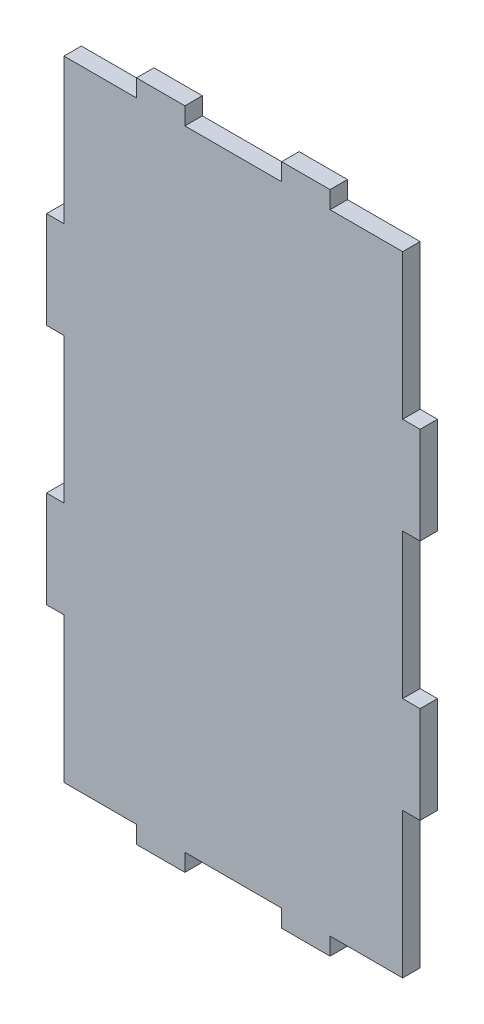
ISO-10303-21;
HEADER;
FILE_DESCRIPTION(('STEP AP214'),'2;1');
FILE_NAME('part.step','',(''),(''),'','','');
FILE_SCHEMA(('AUTOMOTIVE_DESIGN { 1 0 10303 214 1 1 1 1 }'));
ENDSEC;
DATA;
#1=APPLICATION_CONTEXT('core data for automotive mechanical design processes');
#2=APPLICATION_PROTOCOL_DEFINITION('international standard','automotive_design',2000,#1);
#3=PRODUCT_CONTEXT('',#1,'mechanical');
#4=PRODUCT('Part','Part','',(#3));
#5=PRODUCT_RELATED_PRODUCT_CATEGORY('part','',(#4));
#6=PRODUCT_DEFINITION_FORMATION('','',#4);
#7=PRODUCT_DEFINITION_CONTEXT('part definition',#1,'design');
#8=PRODUCT_DEFINITION('design','',#6,#7);
#9=PRODUCT_DEFINITION_SHAPE('','',#8);
#10=(LENGTH_UNIT() NAMED_UNIT(*) SI_UNIT(.MILLI.,.METRE.));
#11=(NAMED_UNIT(*) PLANE_ANGLE_UNIT() SI_UNIT($,.RADIAN.));
#12=(NAMED_UNIT(*) SI_UNIT($,.STERADIAN.) SOLID_ANGLE_UNIT());
#13=UNCERTAINTY_MEASURE_WITH_UNIT(LENGTH_MEASURE(1.E-05),#10,'distance_accuracy_value','');
#14=(GEOMETRIC_REPRESENTATION_CONTEXT(3) GLOBAL_UNCERTAINTY_ASSIGNED_CONTEXT((#13)) GLOBAL_UNIT_ASSIGNED_CONTEXT((#10,
#11,#12)) REPRESENTATION_CONTEXT('',''));
#15=CARTESIAN_POINT('',(0.,0.,0.));
#16=DIRECTION('',(0.,0.,1.));
#17=DIRECTION('',(1.,0.,0.));
#18=AXIS2_PLACEMENT_3D('',#15,#16,#17);
#19=CARTESIAN_POINT('',(0.,0.,4.572));
#20=DIRECTION('',(1.,0.,0.));
#21=DIRECTION('',(0.,0.,-1.));
#22=AXIS2_PLACEMENT_3D('',#19,#20,#21);
#23=PLANE('',#22);
#24=DIRECTION('',(0.,-1.,0.));
#25=VECTOR('',#24,1.);
#26=CARTESIAN_POINT('',(0.,0.,0.));
#27=LINE('',#26,#25);
#28=CARTESIAN_POINT('',(0.,131.572,0.));
#29=VERTEX_POINT('',#28);
#30=CARTESIAN_POINT('',(0.,106.172,0.));
#31=VERTEX_POINT('',#30);
#32=EDGE_CURVE('E302',#29,#31,#27,.T.);
#33=ORIENTED_EDGE('',*,*,#32,.T.);
#34=DIRECTION('',(0.,0.,1.));
#35=VECTOR('',#34,1.);
#36=CARTESIAN_POINT('',(0.,106.172,0.));
#37=LINE('',#36,#35);
#38=CARTESIAN_POINT('',(0.,106.172,4.572));
#39=VERTEX_POINT('',#38);
#40=EDGE_CURVE('E492',#31,#39,#37,.T.);
#41=ORIENTED_EDGE('',*,*,#40,.T.);
#42=DIRECTION('',(0.,-1.,0.));
#43=VECTOR('',#42,1.);
#44=CARTESIAN_POINT('',(0.,0.,4.572));
#45=LINE('',#44,#43);
#46=CARTESIAN_POINT('',(0.,131.572,4.572));
#47=VERTEX_POINT('',#46);
#48=EDGE_CURVE('E314',#47,#39,#45,.T.);
#49=ORIENTED_EDGE('',*,*,#48,.F.);
#50=DIRECTION('',(0.,0.,1.));
#51=VECTOR('',#50,1.);
#52=CARTESIAN_POINT('',(0.,131.572,0.));
#53=LINE('',#52,#51);
#54=EDGE_CURVE('E467',#29,#47,#53,.T.);
#55=ORIENTED_EDGE('',*,*,#54,.F.);
#56=EDGE_LOOP('',(#33,#41,#49,#55));
#57=FACE_BOUND('',#56,.T.);
#58=ADVANCED_FACE('F33',(#57),#23,.F.);
#59=CARTESIAN_POINT('',(98.044,0.,4.572));
#60=DIRECTION('',(-1.,0.,0.));
#61=DIRECTION('',(0.,0.,1.));
#62=AXIS2_PLACEMENT_3D('',#59,#60,#61);
#63=PLANE('',#62);
#64=DIRECTION('',(0.,1.,0.));
#65=VECTOR('',#64,1.);
#66=CARTESIAN_POINT('',(98.044,0.,4.572));
#67=LINE('',#66,#65);
#68=CARTESIAN_POINT('',(98.044,42.672,4.572));
#69=VERTEX_POINT('',#68);
#70=CARTESIAN_POINT('',(98.044,68.072,4.572));
#71=VERTEX_POINT('',#70);
#72=EDGE_CURVE('E308',#69,#71,#67,.T.);
#73=ORIENTED_EDGE('',*,*,#72,.F.);
#74=DIRECTION('',(0.,0.,1.));
#75=VECTOR('',#74,1.);
#76=CARTESIAN_POINT('',(98.044,42.672,0.));
#77=LINE('',#76,#75);
#78=CARTESIAN_POINT('',(98.044,42.672,0.));
#79=VERTEX_POINT('',#78);
#80=EDGE_CURVE('E509',#79,#69,#77,.T.);
#81=ORIENTED_EDGE('',*,*,#80,.F.);
#82=DIRECTION('',(0.,1.,0.));
#83=VECTOR('',#82,1.);
#84=CARTESIAN_POINT('',(98.044,0.,0.));
#85=LINE('',#84,#83);
#86=CARTESIAN_POINT('',(98.044,68.072,0.));
#87=VERTEX_POINT('',#86);
#88=EDGE_CURVE('E294',#79,#87,#85,.T.);
#89=ORIENTED_EDGE('',*,*,#88,.T.);
#90=DIRECTION('',(0.,0.,1.));
#91=VECTOR('',#90,1.);
#92=CARTESIAN_POINT('',(98.044,68.072,0.));
#93=LINE('',#92,#91);
#94=EDGE_CURVE('E464',#87,#71,#93,.T.);
#95=ORIENTED_EDGE('',*,*,#94,.T.);
#96=EDGE_LOOP('',(#73,#81,#89,#95));
#97=FACE_BOUND('',#96,.T.);
#98=ADVANCED_FACE('F543',(#97),#63,.F.);
#99=CARTESIAN_POINT('',(0.,0.,4.572));
#100=DIRECTION('',(0.,1.,0.));
#101=DIRECTION('',(0.,0.,1.));
#102=AXIS2_PLACEMENT_3D('',#99,#100,#101);
#103=PLANE('',#102);
#104=DIRECTION('',(1.,0.,0.));
#105=VECTOR('',#104,1.);
#106=CARTESIAN_POINT('',(0.,0.,0.));
#107=LINE('',#106,#105);
#108=CARTESIAN_POINT('',(23.622,0.,0.));
#109=VERTEX_POINT('',#108);
#110=CARTESIAN_POINT('',(36.322,0.,0.));
#111=VERTEX_POINT('',#110);
#112=EDGE_CURVE('E295',#109,#111,#107,.T.);
#113=ORIENTED_EDGE('',*,*,#112,.T.);
#114=DIRECTION('',(0.,0.,1.));
#115=VECTOR('',#114,1.);
#116=CARTESIAN_POINT('',(36.322,0.,0.));
#117=LINE('',#116,#115);
#118=CARTESIAN_POINT('',(36.322,0.,4.572));
#119=VERTEX_POINT('',#118);
#120=EDGE_CURVE('E393',#111,#119,#117,.T.);
#121=ORIENTED_EDGE('',*,*,#120,.T.);
#122=DIRECTION('',(1.,0.,0.));
#123=VECTOR('',#122,1.);
#124=CARTESIAN_POINT('',(0.,0.,4.572));
#125=LINE('',#124,#123);
#126=CARTESIAN_POINT('',(23.622,0.,4.572));
#127=VERTEX_POINT('',#126);
#128=EDGE_CURVE('E310',#127,#119,#125,.T.);
#129=ORIENTED_EDGE('',*,*,#128,.F.);
#130=DIRECTION('',(0.,0.,1.));
#131=VECTOR('',#130,1.);
#132=CARTESIAN_POINT('',(23.622,0.,0.));
#133=LINE('',#132,#131);
#134=EDGE_CURVE('E319',#109,#127,#133,.T.);
#135=ORIENTED_EDGE('',*,*,#134,.F.);
#136=EDGE_LOOP('',(#113,#121,#129,#135));
#137=FACE_BOUND('',#136,.T.);
#138=ADVANCED_FACE('F584',(#137),#103,.F.);
#139=CARTESIAN_POINT('',(0.,174.244,4.572));
#140=DIRECTION('',(0.,-1.,0.));
#141=DIRECTION('',(0.,0.,-1.));
#142=AXIS2_PLACEMENT_3D('',#139,#140,#141);
#143=PLANE('',#142);
#144=DIRECTION('',(-1.,0.,0.));
#145=VECTOR('',#144,1.);
#146=CARTESIAN_POINT('',(0.,174.244,0.));
#147=LINE('',#146,#145);
#148=CARTESIAN_POINT('',(36.322,174.244,0.));
#149=VERTEX_POINT('',#148);
#150=CARTESIAN_POINT('',(23.622,174.244,0.));
#151=VERTEX_POINT('',#150);
#152=EDGE_CURVE('E37',#149,#151,#147,.T.);
#153=ORIENTED_EDGE('',*,*,#152,.T.);
#154=DIRECTION('',(0.,0.,1.));
#155=VECTOR('',#154,1.);
#156=CARTESIAN_POINT('',(23.622,174.244,0.));
#157=LINE('',#156,#155);
#158=CARTESIAN_POINT('',(23.622,174.244,4.572));
#159=VERTEX_POINT('',#158);
#160=EDGE_CURVE('E366',#151,#159,#157,.T.);
#161=ORIENTED_EDGE('',*,*,#160,.T.);
#162=DIRECTION('',(-1.,0.,0.));
#163=VECTOR('',#162,1.);
#164=CARTESIAN_POINT('',(0.,174.244,4.572));
#165=LINE('',#164,#163);
#166=CARTESIAN_POINT('',(36.322,174.244,4.572));
#167=VERTEX_POINT('',#166);
#168=EDGE_CURVE('E42',#167,#159,#165,.T.);
#169=ORIENTED_EDGE('',*,*,#168,.F.);
#170=DIRECTION('',(0.,0.,1.));
#171=VECTOR('',#170,1.);
#172=CARTESIAN_POINT('',(36.322,174.244,0.));
#173=LINE('',#172,#171);
#174=EDGE_CURVE('E343',#149,#167,#173,.T.);
#175=ORIENTED_EDGE('',*,*,#174,.F.);
#176=EDGE_LOOP('',(#153,#161,#169,#175));
#177=FACE_BOUND('',#176,.T.);
#178=ADVANCED_FACE('F640',(#177),#143,.F.);
#179=CARTESIAN_POINT('',(0.,68.072,4.572));
#180=VERTEX_POINT('',#179);
#181=CARTESIAN_POINT('',(0.,42.672,4.572));
#182=VERTEX_POINT('',#181);
#183=EDGE_CURVE('E315',#180,#182,#45,.T.);
#184=ORIENTED_EDGE('',*,*,#183,.F.);
#185=DIRECTION('',(0.,0.,1.));
#186=VECTOR('',#185,1.);
#187=CARTESIAN_POINT('',(0.,68.072,0.));
#188=LINE('',#187,#186);
#189=CARTESIAN_POINT('',(0.,68.072,0.));
#190=VERTEX_POINT('',#189);
#191=EDGE_CURVE('E485',#190,#180,#188,.T.);
#192=ORIENTED_EDGE('',*,*,#191,.F.);
#193=CARTESIAN_POINT('',(0.,42.672,0.));
#194=VERTEX_POINT('',#193);
#195=EDGE_CURVE('E303',#190,#194,#27,.T.);
#196=ORIENTED_EDGE('',*,*,#195,.T.);
#197=DIRECTION('',(0.,0.,1.));
#198=VECTOR('',#197,1.);
#199=CARTESIAN_POINT('',(0.,42.672,0.));
#200=LINE('',#199,#198);
#201=EDGE_CURVE('E428',#194,#182,#200,.T.);
#202=ORIENTED_EDGE('',*,*,#201,.T.);
#203=EDGE_LOOP('',(#184,#192,#196,#202));
#204=FACE_BOUND('',#203,.T.);
#205=ADVANCED_FACE('F35',(#204),#23,.F.);
#206=CARTESIAN_POINT('',(61.722,0.,4.572));
#207=VERTEX_POINT('',#206);
#208=CARTESIAN_POINT('',(74.422,0.,4.572));
#209=VERTEX_POINT('',#208);
#210=EDGE_CURVE('E311',#207,#209,#125,.T.);
#211=ORIENTED_EDGE('',*,*,#210,.F.);
#212=DIRECTION('',(0.,0.,1.));
#213=VECTOR('',#212,1.);
#214=CARTESIAN_POINT('',(61.722,0.,0.));
#215=LINE('',#214,#213);
#216=CARTESIAN_POINT('',(61.722,0.,0.));
#217=VERTEX_POINT('',#216);
#218=EDGE_CURVE('E396',#217,#207,#215,.T.);
#219=ORIENTED_EDGE('',*,*,#218,.F.);
#220=CARTESIAN_POINT('',(74.422,0.,0.));
#221=VERTEX_POINT('',#220);
#222=EDGE_CURVE('E298',#217,#221,#107,.T.);
#223=ORIENTED_EDGE('',*,*,#222,.T.);
#224=DIRECTION('',(0.,0.,1.));
#225=VECTOR('',#224,1.);
#226=CARTESIAN_POINT('',(74.422,0.,0.));
#227=LINE('',#226,#225);
#228=EDGE_CURVE('E381',#221,#209,#227,.T.);
#229=ORIENTED_EDGE('',*,*,#228,.T.);
#230=EDGE_LOOP('',(#211,#219,#223,#229));
#231=FACE_BOUND('',#230,.T.);
#232=ADVANCED_FACE('F567',(#231),#103,.F.);
#233=CARTESIAN_POINT('',(98.044,106.172,0.));
#234=VERTEX_POINT('',#233);
#235=CARTESIAN_POINT('',(98.044,131.572,0.));
#236=VERTEX_POINT('',#235);
#237=EDGE_CURVE('E283',#234,#236,#85,.T.);
#238=ORIENTED_EDGE('',*,*,#237,.T.);
#239=DIRECTION('',(0.,0.,1.));
#240=VECTOR('',#239,1.);
#241=CARTESIAN_POINT('',(98.044,131.572,0.));
#242=LINE('',#241,#240);
#243=CARTESIAN_POINT('',(98.044,131.572,4.572));
#244=VERTEX_POINT('',#243);
#245=EDGE_CURVE('E455',#236,#244,#242,.T.);
#246=ORIENTED_EDGE('',*,*,#245,.T.);
#247=CARTESIAN_POINT('',(98.044,106.172,4.572));
#248=VERTEX_POINT('',#247);
#249=EDGE_CURVE('E285',#248,#244,#67,.T.);
#250=ORIENTED_EDGE('',*,*,#249,.F.);
#251=DIRECTION('',(0.,0.,1.));
#252=VECTOR('',#251,1.);
#253=CARTESIAN_POINT('',(98.044,106.172,0.));
#254=LINE('',#253,#252);
#255=EDGE_CURVE('E271',#234,#248,#254,.T.);
#256=ORIENTED_EDGE('',*,*,#255,.F.);
#257=EDGE_LOOP('',(#238,#246,#250,#256));
#258=FACE_BOUND('',#257,.T.);
#259=ADVANCED_FACE('F281',(#258),#63,.F.);
#260=CARTESIAN_POINT('',(74.422,174.244,0.));
#261=VERTEX_POINT('',#260);
#262=CARTESIAN_POINT('',(61.722,174.244,0.));
#263=VERTEX_POINT('',#262);
#264=EDGE_CURVE('E318',#261,#263,#147,.T.);
#265=ORIENTED_EDGE('',*,*,#264,.T.);
#266=DIRECTION('',(0.,0.,1.));
#267=VECTOR('',#266,1.);
#268=CARTESIAN_POINT('',(61.722,174.244,0.));
#269=LINE('',#268,#267);
#270=CARTESIAN_POINT('',(61.722,174.244,4.572));
#271=VERTEX_POINT('',#270);
#272=EDGE_CURVE('E340',#263,#271,#269,.T.);
#273=ORIENTED_EDGE('',*,*,#272,.T.);
#274=CARTESIAN_POINT('',(74.422,174.244,4.572));
#275=VERTEX_POINT('',#274);
#276=EDGE_CURVE('E11',#275,#271,#165,.T.);
#277=ORIENTED_EDGE('',*,*,#276,.F.);
#278=DIRECTION('',(0.,0.,1.));
#279=VECTOR('',#278,1.);
#280=CARTESIAN_POINT('',(74.422,174.244,0.));
#281=LINE('',#280,#279);
#282=EDGE_CURVE('E417',#261,#275,#281,.T.);
#283=ORIENTED_EDGE('',*,*,#282,.F.);
#284=EDGE_LOOP('',(#265,#273,#277,#283));
#285=FACE_BOUND('',#284,.T.);
#286=ADVANCED_FACE('F647',(#285),#143,.F.);
#287=CARTESIAN_POINT('',(0.,0.,4.572));
#288=DIRECTION('',(0.,0.,-1.));
#289=DIRECTION('',(-1.,0.,0.));
#290=AXIS2_PLACEMENT_3D('',#287,#288,#289);
#291=PLANE('',#290);
#292=DIRECTION('',(-1.,0.,0.));
#293=VECTOR('',#292,1.);
#294=CARTESIAN_POINT('',(98.044,4.572,4.572));
#295=LINE('',#294,#293);
#296=CARTESIAN_POINT('',(93.472,4.572,4.572));
#297=VERTEX_POINT('',#296);
#298=CARTESIAN_POINT('',(74.422,4.572,4.572));
#299=VERTEX_POINT('',#298);
#300=EDGE_CURVE('E370',#297,#299,#295,.T.);
#301=ORIENTED_EDGE('',*,*,#300,.F.);
#302=DIRECTION('',(0.,-1.,0.));
#303=VECTOR('',#302,1.);
#304=CARTESIAN_POINT('',(93.472,4.572,4.572));
#305=LINE('',#304,#303);
#306=CARTESIAN_POINT('',(93.472,42.672,4.572));
#307=VERTEX_POINT('',#306);
#308=EDGE_CURVE('E516',#307,#297,#305,.T.);
#309=ORIENTED_EDGE('',*,*,#308,.F.);
#310=DIRECTION('',(-1.,0.,0.));
#311=VECTOR('',#310,1.);
#312=CARTESIAN_POINT('',(98.044,42.672,4.572));
#313=LINE('',#312,#311);
#314=EDGE_CURVE('E495',#69,#307,#313,.T.);
#315=ORIENTED_EDGE('',*,*,#314,.F.);
#316=ORIENTED_EDGE('',*,*,#72,.T.);
#317=DIRECTION('',(1.,0.,0.));
#318=VECTOR('',#317,1.);
#319=CARTESIAN_POINT('',(98.044,68.072,4.572));
#320=LINE('',#319,#318);
#321=CARTESIAN_POINT('',(93.472,68.072,4.572));
#322=VERTEX_POINT('',#321);
#323=EDGE_CURVE('E276',#322,#71,#320,.T.);
#324=ORIENTED_EDGE('',*,*,#323,.F.);
#325=DIRECTION('',(0.,-1.,0.));
#326=VECTOR('',#325,1.);
#327=CARTESIAN_POINT('',(93.472,106.172,4.572));
#328=LINE('',#327,#326);
#329=CARTESIAN_POINT('',(93.472,106.172,4.572));
#330=VERTEX_POINT('',#329);
#331=EDGE_CURVE('E530',#330,#322,#328,.T.);
#332=ORIENTED_EDGE('',*,*,#331,.F.);
#333=DIRECTION('',(-1.,0.,0.));
#334=VECTOR('',#333,1.);
#335=CARTESIAN_POINT('',(98.044,106.172,4.572));
#336=LINE('',#335,#334);
#337=EDGE_CURVE('E533',#248,#330,#336,.T.);
#338=ORIENTED_EDGE('',*,*,#337,.F.);
#339=ORIENTED_EDGE('',*,*,#249,.T.);
#340=DIRECTION('',(1.,0.,0.));
#341=VECTOR('',#340,1.);
#342=CARTESIAN_POINT('',(98.044,131.572,4.572));
#343=LINE('',#342,#341);
#344=CARTESIAN_POINT('',(93.472,131.572,4.572));
#345=VERTEX_POINT('',#344);
#346=EDGE_CURVE('E458',#345,#244,#343,.T.);
#347=ORIENTED_EDGE('',*,*,#346,.F.);
#348=DIRECTION('',(0.,-1.,0.));
#349=VECTOR('',#348,1.);
#350=CARTESIAN_POINT('',(93.472,169.672,4.572));
#351=LINE('',#350,#349);
#352=CARTESIAN_POINT('',(93.472,169.672,4.572));
#353=VERTEX_POINT('',#352);
#354=EDGE_CURVE('E461',#353,#345,#351,.T.);
#355=ORIENTED_EDGE('',*,*,#354,.F.);
#356=DIRECTION('',(1.,0.,0.));
#357=VECTOR('',#356,1.);
#358=CARTESIAN_POINT('',(98.044,169.672,4.572));
#359=LINE('',#358,#357);
#360=CARTESIAN_POINT('',(74.422,169.672,4.572));
#361=VERTEX_POINT('',#360);
#362=EDGE_CURVE('E421',#361,#353,#359,.T.);
#363=ORIENTED_EDGE('',*,*,#362,.F.);
#364=DIRECTION('',(0.,-1.,0.));
#365=VECTOR('',#364,1.);
#366=CARTESIAN_POINT('',(74.422,174.244,4.572));
#367=LINE('',#366,#365);
#368=EDGE_CURVE('E425',#275,#361,#367,.T.);
#369=ORIENTED_EDGE('',*,*,#368,.F.);
#370=ORIENTED_EDGE('',*,*,#276,.T.);
#371=DIRECTION('',(0.,1.,0.));
#372=VECTOR('',#371,1.);
#373=CARTESIAN_POINT('',(61.722,174.244,4.572));
#374=LINE('',#373,#372);
#375=CARTESIAN_POINT('',(61.722,169.672,4.572));
#376=VERTEX_POINT('',#375);
#377=EDGE_CURVE('E346',#376,#271,#374,.T.);
#378=ORIENTED_EDGE('',*,*,#377,.F.);
#379=DIRECTION('',(1.,0.,0.));
#380=VECTOR('',#379,1.);
#381=CARTESIAN_POINT('',(36.322,169.672,4.572));
#382=LINE('',#381,#380);
#383=CARTESIAN_POINT('',(36.322,169.672,4.572));
#384=VERTEX_POINT('',#383);
#385=EDGE_CURVE('E349',#384,#376,#382,.T.);
#386=ORIENTED_EDGE('',*,*,#385,.F.);
#387=DIRECTION('',(0.,-1.,0.));
#388=VECTOR('',#387,1.);
#389=CARTESIAN_POINT('',(36.322,174.244,4.572));
#390=LINE('',#389,#388);
#391=EDGE_CURVE('E352',#167,#384,#390,.T.);
#392=ORIENTED_EDGE('',*,*,#391,.F.);
#393=ORIENTED_EDGE('',*,*,#168,.T.);
#394=DIRECTION('',(0.,1.,0.));
#395=VECTOR('',#394,1.);
#396=CARTESIAN_POINT('',(23.622,174.244,4.572));
#397=LINE('',#396,#395);
#398=CARTESIAN_POINT('',(23.622,169.672,4.572));
#399=VERTEX_POINT('',#398);
#400=EDGE_CURVE('E371',#399,#159,#397,.T.);
#401=ORIENTED_EDGE('',*,*,#400,.F.);
#402=DIRECTION('',(1.,0.,0.));
#403=VECTOR('',#402,1.);
#404=CARTESIAN_POINT('',(0.,169.672,4.572));
#405=LINE('',#404,#403);
#406=CARTESIAN_POINT('',(4.572,169.672,4.572));
#407=VERTEX_POINT('',#406);
#408=EDGE_CURVE('E345',#407,#399,#405,.T.);
#409=ORIENTED_EDGE('',*,*,#408,.F.);
#410=DIRECTION('',(0.,1.,0.));
#411=VECTOR('',#410,1.);
#412=CARTESIAN_POINT('',(4.572,169.672,4.572));
#413=LINE('',#412,#411);
#414=CARTESIAN_POINT('',(4.572,131.572,4.572));
#415=VERTEX_POINT('',#414);
#416=EDGE_CURVE('E476',#415,#407,#413,.T.);
#417=ORIENTED_EDGE('',*,*,#416,.F.);
#418=DIRECTION('',(1.,0.,0.));
#419=VECTOR('',#418,1.);
#420=CARTESIAN_POINT('',(0.,131.572,4.572));
#421=LINE('',#420,#419);
#422=EDGE_CURVE('E457',#47,#415,#421,.T.);
#423=ORIENTED_EDGE('',*,*,#422,.F.);
#424=ORIENTED_EDGE('',*,*,#48,.T.);
#425=DIRECTION('',(-1.,0.,0.));
#426=VECTOR('',#425,1.);
#427=CARTESIAN_POINT('',(0.,106.172,4.572));
#428=LINE('',#427,#426);
#429=CARTESIAN_POINT('',(4.572,106.172,4.572));
#430=VERTEX_POINT('',#429);
#431=EDGE_CURVE('E496',#430,#39,#428,.T.);
#432=ORIENTED_EDGE('',*,*,#431,.F.);
#433=DIRECTION('',(0.,1.,0.));
#434=VECTOR('',#433,1.);
#435=CARTESIAN_POINT('',(4.572,106.172,4.572));
#436=LINE('',#435,#434);
#437=CARTESIAN_POINT('',(4.572,68.072,4.572));
#438=VERTEX_POINT('',#437);
#439=EDGE_CURVE('E499',#438,#430,#436,.T.);
#440=ORIENTED_EDGE('',*,*,#439,.F.);
#441=DIRECTION('',(1.,0.,0.));
#442=VECTOR('',#441,1.);
#443=CARTESIAN_POINT('',(0.,68.072,4.572));
#444=LINE('',#443,#442);
#445=EDGE_CURVE('E475',#180,#438,#444,.T.);
#446=ORIENTED_EDGE('',*,*,#445,.F.);
#447=ORIENTED_EDGE('',*,*,#183,.T.);
#448=DIRECTION('',(-1.,0.,0.));
#449=VECTOR('',#448,1.);
#450=CARTESIAN_POINT('',(0.,42.672,4.572));
#451=LINE('',#450,#449);
#452=CARTESIAN_POINT('',(4.572,42.672,4.572));
#453=VERTEX_POINT('',#452);
#454=EDGE_CURVE('E440',#453,#182,#451,.T.);
#455=ORIENTED_EDGE('',*,*,#454,.F.);
#456=DIRECTION('',(0.,1.,0.));
#457=VECTOR('',#456,1.);
#458=CARTESIAN_POINT('',(4.57200000000001,4.572,4.572));
#459=LINE('',#458,#457);
#460=CARTESIAN_POINT('',(4.57200000000001,4.572,4.572));
#461=VERTEX_POINT('',#460);
#462=EDGE_CURVE('E443',#461,#453,#459,.T.);
#463=ORIENTED_EDGE('',*,*,#462,.F.);
#464=DIRECTION('',(-1.,0.,0.));
#465=VECTOR('',#464,1.);
#466=CARTESIAN_POINT('',(0.,4.572,4.572));
#467=LINE('',#466,#465);
#468=CARTESIAN_POINT('',(23.622,4.572,4.572));
#469=VERTEX_POINT('',#468);
#470=EDGE_CURVE('E323',#469,#461,#467,.T.);
#471=ORIENTED_EDGE('',*,*,#470,.F.);
#472=DIRECTION('',(0.,1.,0.));
#473=VECTOR('',#472,1.);
#474=CARTESIAN_POINT('',(23.622,0.,4.572));
#475=LINE('',#474,#473);
#476=EDGE_CURVE('E327',#127,#469,#475,.T.);
#477=ORIENTED_EDGE('',*,*,#476,.F.);
#478=ORIENTED_EDGE('',*,*,#128,.T.);
#479=DIRECTION('',(0.,-1.,0.));
#480=VECTOR('',#479,1.);
#481=CARTESIAN_POINT('',(36.322,0.,4.572));
#482=LINE('',#481,#480);
#483=CARTESIAN_POINT('',(36.322,4.57200000000003,4.572));
#484=VERTEX_POINT('',#483);
#485=EDGE_CURVE('E385',#484,#119,#482,.T.);
#486=ORIENTED_EDGE('',*,*,#485,.F.);
#487=DIRECTION('',(-1.,0.,0.));
#488=VECTOR('',#487,1.);
#489=CARTESIAN_POINT('',(36.322,4.57200000000003,4.572));
#490=LINE('',#489,#488);
#491=CARTESIAN_POINT('',(61.722,4.57200000000003,4.572));
#492=VERTEX_POINT('',#491);
#493=EDGE_CURVE('E402',#492,#484,#490,.T.);
#494=ORIENTED_EDGE('',*,*,#493,.F.);
#495=DIRECTION('',(0.,1.,0.));
#496=VECTOR('',#495,1.);
#497=CARTESIAN_POINT('',(61.722,0.,4.572));
#498=LINE('',#497,#496);
#499=EDGE_CURVE('E406',#207,#492,#498,.T.);
#500=ORIENTED_EDGE('',*,*,#499,.F.);
#501=ORIENTED_EDGE('',*,*,#210,.T.);
#502=DIRECTION('',(0.,-1.,0.));
#503=VECTOR('',#502,1.);
#504=CARTESIAN_POINT('',(74.422,0.,4.572));
#505=LINE('',#504,#503);
#506=EDGE_CURVE('E386',#299,#209,#505,.T.);
#507=ORIENTED_EDGE('',*,*,#506,.F.);
#508=EDGE_LOOP('',(#301,#309,#315,#316,#324,#332,#338,#339,#347,#355,#363,#369,#370,#378,#386,
#392,#393,#401,#409,#417,#423,#424,#432,#440,#446,#447,#455,#463,#471,#477,#478,#486,#494,#500,
#501,#507));
#509=FACE_BOUND('',#508,.T.);
#510=ADVANCED_FACE('F551',(#509),#291,.F.);
#511=CARTESIAN_POINT('',(0.,0.,0.));
#512=DIRECTION('',(0.,0.,-1.));
#513=DIRECTION('',(-1.,0.,0.));
#514=AXIS2_PLACEMENT_3D('',#511,#512,#513);
#515=PLANE('',#514);
#516=DIRECTION('',(0.,-1.,0.));
#517=VECTOR('',#516,1.);
#518=CARTESIAN_POINT('',(93.472,4.572,0.));
#519=LINE('',#518,#517);
#520=CARTESIAN_POINT('',(93.472,42.672,0.));
#521=VERTEX_POINT('',#520);
#522=CARTESIAN_POINT('',(93.472,4.572,0.));
#523=VERTEX_POINT('',#522);
#524=EDGE_CURVE('E512',#521,#523,#519,.T.);
#525=ORIENTED_EDGE('',*,*,#524,.T.);
#526=DIRECTION('',(-1.,0.,0.));
#527=VECTOR('',#526,1.);
#528=CARTESIAN_POINT('',(98.044,4.572,0.));
#529=LINE('',#528,#527);
#530=CARTESIAN_POINT('',(74.422,4.572,0.));
#531=VERTEX_POINT('',#530);
#532=EDGE_CURVE('E388',#523,#531,#529,.T.);
#533=ORIENTED_EDGE('',*,*,#532,.T.);
#534=DIRECTION('',(0.,-1.,0.));
#535=VECTOR('',#534,1.);
#536=CARTESIAN_POINT('',(74.422,0.,0.));
#537=LINE('',#536,#535);
#538=EDGE_CURVE('E382',#531,#221,#537,.T.);
#539=ORIENTED_EDGE('',*,*,#538,.T.);
#540=ORIENTED_EDGE('',*,*,#222,.F.);
#541=DIRECTION('',(0.,1.,0.));
#542=VECTOR('',#541,1.);
#543=CARTESIAN_POINT('',(61.722,0.,0.));
#544=LINE('',#543,#542);
#545=CARTESIAN_POINT('',(61.722,4.57200000000003,0.));
#546=VERTEX_POINT('',#545);
#547=EDGE_CURVE('E412',#217,#546,#544,.T.);
#548=ORIENTED_EDGE('',*,*,#547,.T.);
#549=DIRECTION('',(-1.,0.,0.));
#550=VECTOR('',#549,1.);
#551=CARTESIAN_POINT('',(36.322,4.57200000000003,0.));
#552=LINE('',#551,#550);
#553=CARTESIAN_POINT('',(36.322,4.57200000000003,0.));
#554=VERTEX_POINT('',#553);
#555=EDGE_CURVE('E397',#546,#554,#552,.T.);
#556=ORIENTED_EDGE('',*,*,#555,.T.);
#557=DIRECTION('',(0.,-1.,0.));
#558=VECTOR('',#557,1.);
#559=CARTESIAN_POINT('',(36.322,0.,0.));
#560=LINE('',#559,#558);
#561=EDGE_CURVE('E405',#554,#111,#560,.T.);
#562=ORIENTED_EDGE('',*,*,#561,.T.);
#563=ORIENTED_EDGE('',*,*,#112,.F.);
#564=DIRECTION('',(0.,1.,0.));
#565=VECTOR('',#564,1.);
#566=CARTESIAN_POINT('',(23.622,0.,0.));
#567=LINE('',#566,#565);
#568=CARTESIAN_POINT('',(23.622,4.572,0.));
#569=VERTEX_POINT('',#568);
#570=EDGE_CURVE('E326',#109,#569,#567,.T.);
#571=ORIENTED_EDGE('',*,*,#570,.T.);
#572=DIRECTION('',(-1.,0.,0.));
#573=VECTOR('',#572,1.);
#574=CARTESIAN_POINT('',(0.,4.572,0.));
#575=LINE('',#574,#573);
#576=CARTESIAN_POINT('',(4.57200000000001,4.572,0.));
#577=VERTEX_POINT('',#576);
#578=EDGE_CURVE('E321',#569,#577,#575,.T.);
#579=ORIENTED_EDGE('',*,*,#578,.T.);
#580=DIRECTION('',(0.,1.,0.));
#581=VECTOR('',#580,1.);
#582=CARTESIAN_POINT('',(4.57200000000001,4.572,0.));
#583=LINE('',#582,#581);
#584=CARTESIAN_POINT('',(4.572,42.672,0.));
#585=VERTEX_POINT('',#584);
#586=EDGE_CURVE('E442',#577,#585,#583,.T.);
#587=ORIENTED_EDGE('',*,*,#586,.T.);
#588=DIRECTION('',(-1.,0.,0.));
#589=VECTOR('',#588,1.);
#590=CARTESIAN_POINT('',(0.,42.672,0.));
#591=LINE('',#590,#589);
#592=EDGE_CURVE('E436',#585,#194,#591,.T.);
#593=ORIENTED_EDGE('',*,*,#592,.T.);
#594=ORIENTED_EDGE('',*,*,#195,.F.);
#595=DIRECTION('',(1.,0.,0.));
#596=VECTOR('',#595,1.);
#597=CARTESIAN_POINT('',(0.,68.072,0.));
#598=LINE('',#597,#596);
#599=CARTESIAN_POINT('',(4.572,68.072,0.));
#600=VERTEX_POINT('',#599);
#601=EDGE_CURVE('E498',#190,#600,#598,.T.);
#602=ORIENTED_EDGE('',*,*,#601,.T.);
#603=DIRECTION('',(0.,1.,0.));
#604=VECTOR('',#603,1.);
#605=CARTESIAN_POINT('',(4.572,106.172,0.));
#606=LINE('',#605,#604);
#607=CARTESIAN_POINT('',(4.572,106.172,0.));
#608=VERTEX_POINT('',#607);
#609=EDGE_CURVE('E50',#600,#608,#606,.T.);
#610=ORIENTED_EDGE('',*,*,#609,.T.);
#611=DIRECTION('',(-1.,0.,0.));
#612=VECTOR('',#611,1.);
#613=CARTESIAN_POINT('',(0.,106.172,0.));
#614=LINE('',#613,#612);
#615=EDGE_CURVE('E488',#608,#31,#614,.T.);
#616=ORIENTED_EDGE('',*,*,#615,.T.);
#617=ORIENTED_EDGE('',*,*,#32,.F.);
#618=DIRECTION('',(1.,0.,0.));
#619=VECTOR('',#618,1.);
#620=CARTESIAN_POINT('',(0.,131.572,0.));
#621=LINE('',#620,#619);
#622=CARTESIAN_POINT('',(4.572,131.572,0.));
#623=VERTEX_POINT('',#622);
#624=EDGE_CURVE('E478',#29,#623,#621,.T.);
#625=ORIENTED_EDGE('',*,*,#624,.T.);
#626=DIRECTION('',(0.,1.,0.));
#627=VECTOR('',#626,1.);
#628=CARTESIAN_POINT('',(4.572,169.672,0.));
#629=LINE('',#628,#627);
#630=CARTESIAN_POINT('',(4.572,169.672,0.));
#631=VERTEX_POINT('',#630);
#632=EDGE_CURVE('E470',#623,#631,#629,.T.);
#633=ORIENTED_EDGE('',*,*,#632,.T.);
#634=DIRECTION('',(1.,0.,0.));
#635=VECTOR('',#634,1.);
#636=CARTESIAN_POINT('',(0.,169.672,0.));
#637=LINE('',#636,#635);
#638=CARTESIAN_POINT('',(23.622,169.672,0.));
#639=VERTEX_POINT('',#638);
#640=EDGE_CURVE('E373',#631,#639,#637,.T.);
#641=ORIENTED_EDGE('',*,*,#640,.T.);
#642=DIRECTION('',(0.,1.,0.));
#643=VECTOR('',#642,1.);
#644=CARTESIAN_POINT('',(23.622,174.244,0.));
#645=LINE('',#644,#643);
#646=EDGE_CURVE('E367',#639,#151,#645,.T.);
#647=ORIENTED_EDGE('',*,*,#646,.T.);
#648=ORIENTED_EDGE('',*,*,#152,.F.);
#649=DIRECTION('',(0.,-1.,0.));
#650=VECTOR('',#649,1.);
#651=CARTESIAN_POINT('',(36.322,174.244,0.));
#652=LINE('',#651,#650);
#653=CARTESIAN_POINT('',(36.322,169.672,0.));
#654=VERTEX_POINT('',#653);
#655=EDGE_CURVE('E348',#149,#654,#652,.T.);
#656=ORIENTED_EDGE('',*,*,#655,.T.);
#657=DIRECTION('',(1.,0.,0.));
#658=VECTOR('',#657,1.);
#659=CARTESIAN_POINT('',(36.322,169.672,0.));
#660=LINE('',#659,#658);
#661=CARTESIAN_POINT('',(61.722,169.672,0.));
#662=VERTEX_POINT('',#661);
#663=EDGE_CURVE('E358',#654,#662,#660,.T.);
#664=ORIENTED_EDGE('',*,*,#663,.T.);
#665=DIRECTION('',(0.,1.,0.));
#666=VECTOR('',#665,1.);
#667=CARTESIAN_POINT('',(61.722,174.244,0.));
#668=LINE('',#667,#666);
#669=EDGE_CURVE('E338',#662,#263,#668,.T.);
#670=ORIENTED_EDGE('',*,*,#669,.T.);
#671=ORIENTED_EDGE('',*,*,#264,.F.);
#672=DIRECTION('',(0.,-1.,0.));
#673=VECTOR('',#672,1.);
#674=CARTESIAN_POINT('',(74.422,174.244,0.));
#675=LINE('',#674,#673);
#676=CARTESIAN_POINT('',(74.422,169.672,0.));
#677=VERTEX_POINT('',#676);
#678=EDGE_CURVE('E424',#261,#677,#675,.T.);
#679=ORIENTED_EDGE('',*,*,#678,.T.);
#680=DIRECTION('',(1.,0.,0.));
#681=VECTOR('',#680,1.);
#682=CARTESIAN_POINT('',(98.044,169.672,0.));
#683=LINE('',#682,#681);
#684=CARTESIAN_POINT('',(93.472,169.672,0.));
#685=VERTEX_POINT('',#684);
#686=EDGE_CURVE('E419',#677,#685,#683,.T.);
#687=ORIENTED_EDGE('',*,*,#686,.T.);
#688=DIRECTION('',(0.,-1.,0.));
#689=VECTOR('',#688,1.);
#690=CARTESIAN_POINT('',(93.472,169.672,0.));
#691=LINE('',#690,#689);
#692=CARTESIAN_POINT('',(93.472,131.572,0.));
#693=VERTEX_POINT('',#692);
#694=EDGE_CURVE('E460',#685,#693,#691,.T.);
#695=ORIENTED_EDGE('',*,*,#694,.T.);
#696=DIRECTION('',(1.,0.,0.));
#697=VECTOR('',#696,1.);
#698=CARTESIAN_POINT('',(98.044,131.572,0.));
#699=LINE('',#698,#697);
#700=EDGE_CURVE('E293',#693,#236,#699,.T.);
#701=ORIENTED_EDGE('',*,*,#700,.T.);
#702=ORIENTED_EDGE('',*,*,#237,.F.);
#703=DIRECTION('',(-1.,0.,0.));
#704=VECTOR('',#703,1.);
#705=CARTESIAN_POINT('',(98.044,106.172,0.));
#706=LINE('',#705,#704);
#707=CARTESIAN_POINT('',(93.472,106.172,0.));
#708=VERTEX_POINT('',#707);
#709=EDGE_CURVE('E267',#234,#708,#706,.T.);
#710=ORIENTED_EDGE('',*,*,#709,.T.);
#711=DIRECTION('',(0.,-1.,0.));
#712=VECTOR('',#711,1.);
#713=CARTESIAN_POINT('',(93.472,106.172,0.));
#714=LINE('',#713,#712);
#715=CARTESIAN_POINT('',(93.472,68.072,0.));
#716=VERTEX_POINT('',#715);
#717=EDGE_CURVE('E58',#708,#716,#714,.T.);
#718=ORIENTED_EDGE('',*,*,#717,.T.);
#719=DIRECTION('',(1.,0.,0.));
#720=VECTOR('',#719,1.);
#721=CARTESIAN_POINT('',(98.044,68.072,0.));
#722=LINE('',#721,#720);
#723=EDGE_CURVE('E286',#716,#87,#722,.T.);
#724=ORIENTED_EDGE('',*,*,#723,.T.);
#725=ORIENTED_EDGE('',*,*,#88,.F.);
#726=DIRECTION('',(-1.,0.,0.));
#727=VECTOR('',#726,1.);
#728=CARTESIAN_POINT('',(98.044,42.672,0.));
#729=LINE('',#728,#727);
#730=EDGE_CURVE('E518',#79,#521,#729,.T.);
#731=ORIENTED_EDGE('',*,*,#730,.T.);
#732=EDGE_LOOP('',(#525,#533,#539,#540,#548,#556,#562,#563,#571,#579,#587,#593,#594,#602,#610,
#616,#617,#625,#633,#641,#647,#648,#656,#664,#670,#671,#679,#687,#695,#701,#702,#710,#718,#724,
#725,#731));
#733=FACE_BOUND('',#732,.T.);
#734=ADVANCED_FACE('F290',(#733),#515,.T.);
#735=CARTESIAN_POINT('',(0.,4.572,0.));
#736=DIRECTION('',(0.,1.,0.));
#737=DIRECTION('',(0.,0.,1.));
#738=AXIS2_PLACEMENT_3D('',#735,#736,#737);
#739=PLANE('',#738);
#740=ORIENTED_EDGE('',*,*,#470,.T.);
#741=DIRECTION('',(0.,0.,1.));
#742=VECTOR('',#741,1.);
#743=CARTESIAN_POINT('',(4.57200000000001,4.572,0.));
#744=LINE('',#743,#742);
#745=EDGE_CURVE('E433',#577,#461,#744,.T.);
#746=ORIENTED_EDGE('',*,*,#745,.F.);
#747=ORIENTED_EDGE('',*,*,#578,.F.);
#748=DIRECTION('',(0.,0.,1.));
#749=VECTOR('',#748,1.);
#750=CARTESIAN_POINT('',(23.622,4.572,0.));
#751=LINE('',#750,#749);
#752=EDGE_CURVE('E305',#569,#469,#751,.T.);
#753=ORIENTED_EDGE('',*,*,#752,.T.);
#754=EDGE_LOOP('',(#740,#746,#747,#753));
#755=FACE_BOUND('',#754,.T.);
#756=ADVANCED_FACE('F594',(#755),#739,.F.);
#757=CARTESIAN_POINT('',(23.622,0.,0.));
#758=DIRECTION('',(1.,0.,0.));
#759=DIRECTION('',(0.,1.,0.));
#760=AXIS2_PLACEMENT_3D('',#757,#758,#759);
#761=PLANE('',#760);
#762=ORIENTED_EDGE('',*,*,#476,.T.);
#763=ORIENTED_EDGE('',*,*,#752,.F.);
#764=ORIENTED_EDGE('',*,*,#570,.F.);
#765=ORIENTED_EDGE('',*,*,#134,.T.);
#766=EDGE_LOOP('',(#762,#763,#764,#765));
#767=FACE_BOUND('',#766,.T.);
#768=ADVANCED_FACE('F591',(#767),#761,.F.);
#769=CARTESIAN_POINT('',(98.044,169.672,0.));
#770=DIRECTION('',(0.,-1.,0.));
#771=DIRECTION('',(0.,0.,-1.));
#772=AXIS2_PLACEMENT_3D('',#769,#770,#771);
#773=PLANE('',#772);
#774=ORIENTED_EDGE('',*,*,#362,.T.);
#775=DIRECTION('',(0.,0.,1.));
#776=VECTOR('',#775,1.);
#777=CARTESIAN_POINT('',(93.472,169.672,0.));
#778=LINE('',#777,#776);
#779=EDGE_CURVE('E451',#685,#353,#778,.T.);
#780=ORIENTED_EDGE('',*,*,#779,.F.);
#781=ORIENTED_EDGE('',*,*,#686,.F.);
#782=DIRECTION('',(0.,0.,1.));
#783=VECTOR('',#782,1.);
#784=CARTESIAN_POINT('',(74.422,169.672,0.));
#785=LINE('',#784,#783);
#786=EDGE_CURVE('E355',#677,#361,#785,.T.);
#787=ORIENTED_EDGE('',*,*,#786,.T.);
#788=EDGE_LOOP('',(#774,#780,#781,#787));
#789=FACE_BOUND('',#788,.T.);
#790=ADVANCED_FACE('F664',(#789),#773,.F.);
#791=CARTESIAN_POINT('',(74.422,174.244,0.));
#792=DIRECTION('',(-1.,0.,0.));
#793=DIRECTION('',(0.,0.,1.));
#794=AXIS2_PLACEMENT_3D('',#791,#792,#793);
#795=PLANE('',#794);
#796=ORIENTED_EDGE('',*,*,#368,.T.);
#797=ORIENTED_EDGE('',*,*,#786,.F.);
#798=ORIENTED_EDGE('',*,*,#678,.F.);
#799=ORIENTED_EDGE('',*,*,#282,.T.);
#800=EDGE_LOOP('',(#796,#797,#798,#799));
#801=FACE_BOUND('',#800,.T.);
#802=ADVANCED_FACE('F662',(#801),#795,.F.);
#803=CARTESIAN_POINT('',(36.322,174.244,0.));
#804=DIRECTION('',(-1.,0.,0.));
#805=DIRECTION('',(0.,-1.,0.));
#806=AXIS2_PLACEMENT_3D('',#803,#804,#805);
#807=PLANE('',#806);
#808=ORIENTED_EDGE('',*,*,#391,.T.);
#809=DIRECTION('',(0.,0.,1.));
#810=VECTOR('',#809,1.);
#811=CARTESIAN_POINT('',(36.322,169.672,0.));
#812=LINE('',#811,#810);
#813=EDGE_CURVE('E335',#654,#384,#812,.T.);
#814=ORIENTED_EDGE('',*,*,#813,.F.);
#815=ORIENTED_EDGE('',*,*,#655,.F.);
#816=ORIENTED_EDGE('',*,*,#174,.T.);
#817=EDGE_LOOP('',(#808,#814,#815,#816));
#818=FACE_BOUND('',#817,.T.);
#819=ADVANCED_FACE('F740',(#818),#807,.F.);
#820=CARTESIAN_POINT('',(61.722,174.244,0.));
#821=DIRECTION('',(1.,0.,0.));
#822=DIRECTION('',(0.,0.,-1.));
#823=AXIS2_PLACEMENT_3D('',#820,#821,#822);
#824=PLANE('',#823);
#825=ORIENTED_EDGE('',*,*,#377,.T.);
#826=ORIENTED_EDGE('',*,*,#272,.F.);
#827=ORIENTED_EDGE('',*,*,#669,.F.);
#828=DIRECTION('',(0.,0.,1.));
#829=VECTOR('',#828,1.);
#830=CARTESIAN_POINT('',(61.722,169.672,0.));
#831=LINE('',#830,#829);
#832=EDGE_CURVE('E337',#662,#376,#831,.T.);
#833=ORIENTED_EDGE('',*,*,#832,.T.);
#834=EDGE_LOOP('',(#825,#826,#827,#833));
#835=FACE_BOUND('',#834,.T.);
#836=ADVANCED_FACE('F652',(#835),#824,.F.);
#837=CARTESIAN_POINT('',(36.322,169.672,0.));
#838=DIRECTION('',(0.,-1.,0.));
#839=DIRECTION('',(0.,0.,-1.));
#840=AXIS2_PLACEMENT_3D('',#837,#838,#839);
#841=PLANE('',#840);
#842=ORIENTED_EDGE('',*,*,#385,.T.);
#843=ORIENTED_EDGE('',*,*,#832,.F.);
#844=ORIENTED_EDGE('',*,*,#663,.F.);
#845=ORIENTED_EDGE('',*,*,#813,.T.);
#846=EDGE_LOOP('',(#842,#843,#844,#845));
#847=FACE_BOUND('',#846,.T.);
#848=ADVANCED_FACE('F654',(#847),#841,.F.);
#849=CARTESIAN_POINT('',(23.622,174.244,0.));
#850=DIRECTION('',(1.,0.,0.));
#851=DIRECTION('',(0.,0.,-1.));
#852=AXIS2_PLACEMENT_3D('',#849,#850,#851);
#853=PLANE('',#852);
#854=ORIENTED_EDGE('',*,*,#400,.T.);
#855=ORIENTED_EDGE('',*,*,#160,.F.);
#856=ORIENTED_EDGE('',*,*,#646,.F.);
#857=DIRECTION('',(0.,0.,1.));
#858=VECTOR('',#857,1.);
#859=CARTESIAN_POINT('',(23.622,169.672,0.));
#860=LINE('',#859,#858);
#861=EDGE_CURVE('E363',#639,#399,#860,.T.);
#862=ORIENTED_EDGE('',*,*,#861,.T.);
#863=EDGE_LOOP('',(#854,#855,#856,#862));
#864=FACE_BOUND('',#863,.T.);
#865=ADVANCED_FACE('F636',(#864),#853,.F.);
#866=CARTESIAN_POINT('',(0.,169.672,0.));
#867=DIRECTION('',(0.,-1.,0.));
#868=DIRECTION('',(0.,0.,-1.));
#869=AXIS2_PLACEMENT_3D('',#866,#867,#868);
#870=PLANE('',#869);
#871=ORIENTED_EDGE('',*,*,#640,.F.);
#872=DIRECTION('',(0.,0.,1.));
#873=VECTOR('',#872,1.);
#874=CARTESIAN_POINT('',(4.572,169.672,0.));
#875=LINE('',#874,#873);
#876=EDGE_CURVE('E472',#631,#407,#875,.T.);
#877=ORIENTED_EDGE('',*,*,#876,.T.);
#878=ORIENTED_EDGE('',*,*,#408,.T.);
#879=ORIENTED_EDGE('',*,*,#861,.F.);
#880=EDGE_LOOP('',(#871,#877,#878,#879));
#881=FACE_BOUND('',#880,.T.);
#882=ADVANCED_FACE('F630',(#881),#870,.F.);
#883=CARTESIAN_POINT('',(74.422,0.,0.));
#884=DIRECTION('',(-1.,0.,0.));
#885=DIRECTION('',(0.,-1.,0.));
#886=AXIS2_PLACEMENT_3D('',#883,#884,#885);
#887=PLANE('',#886);
#888=ORIENTED_EDGE('',*,*,#506,.T.);
#889=ORIENTED_EDGE('',*,*,#228,.F.);
#890=ORIENTED_EDGE('',*,*,#538,.F.);
#891=DIRECTION('',(0.,0.,1.));
#892=VECTOR('',#891,1.);
#893=CARTESIAN_POINT('',(74.422,4.572,0.));
#894=LINE('',#893,#892);
#895=EDGE_CURVE('E378',#531,#299,#894,.T.);
#896=ORIENTED_EDGE('',*,*,#895,.T.);
#897=EDGE_LOOP('',(#888,#889,#890,#896));
#898=FACE_BOUND('',#897,.T.);
#899=ADVANCED_FACE('F564',(#898),#887,.F.);
#900=CARTESIAN_POINT('',(98.044,4.572,0.));
#901=DIRECTION('',(0.,1.,0.));
#902=DIRECTION('',(-1.,0.,0.));
#903=AXIS2_PLACEMENT_3D('',#900,#901,#902);
#904=PLANE('',#903);
#905=ORIENTED_EDGE('',*,*,#532,.F.);
#906=DIRECTION('',(0.,0.,1.));
#907=VECTOR('',#906,1.);
#908=CARTESIAN_POINT('',(93.472,4.572,0.));
#909=LINE('',#908,#907);
#910=EDGE_CURVE('E446',#523,#297,#909,.T.);
#911=ORIENTED_EDGE('',*,*,#910,.T.);
#912=ORIENTED_EDGE('',*,*,#300,.T.);
#913=ORIENTED_EDGE('',*,*,#895,.F.);
#914=EDGE_LOOP('',(#905,#911,#912,#913));
#915=FACE_BOUND('',#914,.T.);
#916=ADVANCED_FACE('F559',(#915),#904,.F.);
#917=CARTESIAN_POINT('',(36.322,0.,0.));
#918=DIRECTION('',(-1.,0.,0.));
#919=DIRECTION('',(0.,0.,1.));
#920=AXIS2_PLACEMENT_3D('',#917,#918,#919);
#921=PLANE('',#920);
#922=ORIENTED_EDGE('',*,*,#485,.T.);
#923=ORIENTED_EDGE('',*,*,#120,.F.);
#924=ORIENTED_EDGE('',*,*,#561,.F.);
#925=DIRECTION('',(0.,0.,1.));
#926=VECTOR('',#925,1.);
#927=CARTESIAN_POINT('',(36.322,4.57200000000003,0.));
#928=LINE('',#927,#926);
#929=EDGE_CURVE('E330',#554,#484,#928,.T.);
#930=ORIENTED_EDGE('',*,*,#929,.T.);
#931=EDGE_LOOP('',(#922,#923,#924,#930));
#932=FACE_BOUND('',#931,.T.);
#933=ADVANCED_FACE('F580',(#932),#921,.F.);
#934=CARTESIAN_POINT('',(36.322,4.57200000000003,0.));
#935=DIRECTION('',(0.,1.,0.));
#936=DIRECTION('',(0.,0.,1.));
#937=AXIS2_PLACEMENT_3D('',#934,#935,#936);
#938=PLANE('',#937);
#939=ORIENTED_EDGE('',*,*,#493,.T.);
#940=ORIENTED_EDGE('',*,*,#929,.F.);
#941=ORIENTED_EDGE('',*,*,#555,.F.);
#942=DIRECTION('',(0.,0.,1.));
#943=VECTOR('',#942,1.);
#944=CARTESIAN_POINT('',(61.722,4.57200000000003,0.));
#945=LINE('',#944,#943);
#946=EDGE_CURVE('E399',#546,#492,#945,.T.);
#947=ORIENTED_EDGE('',*,*,#946,.T.);
#948=EDGE_LOOP('',(#939,#940,#941,#947));
#949=FACE_BOUND('',#948,.T.);
#950=ADVANCED_FACE('F578',(#949),#938,.F.);
#951=CARTESIAN_POINT('',(61.722,0.,0.));
#952=DIRECTION('',(1.,0.,0.));
#953=DIRECTION('',(0.,0.,-1.));
#954=AXIS2_PLACEMENT_3D('',#951,#952,#953);
#955=PLANE('',#954);
#956=ORIENTED_EDGE('',*,*,#499,.T.);
#957=ORIENTED_EDGE('',*,*,#946,.F.);
#958=ORIENTED_EDGE('',*,*,#547,.F.);
#959=ORIENTED_EDGE('',*,*,#218,.T.);
#960=EDGE_LOOP('',(#956,#957,#958,#959));
#961=FACE_BOUND('',#960,.T.);
#962=ADVANCED_FACE('F574',(#961),#955,.F.);
#963=CARTESIAN_POINT('',(93.472,4.572,0.));
#964=DIRECTION('',(-1.,0.,0.));
#965=DIRECTION('',(0.,0.,1.));
#966=AXIS2_PLACEMENT_3D('',#963,#964,#965);
#967=PLANE('',#966);
#968=ORIENTED_EDGE('',*,*,#308,.T.);
#969=ORIENTED_EDGE('',*,*,#910,.F.);
#970=ORIENTED_EDGE('',*,*,#524,.F.);
#971=DIRECTION('',(0.,0.,1.));
#972=VECTOR('',#971,1.);
#973=CARTESIAN_POINT('',(93.472,42.672,0.));
#974=LINE('',#973,#972);
#975=EDGE_CURVE('E511',#521,#307,#974,.T.);
#976=ORIENTED_EDGE('',*,*,#975,.T.);
#977=EDGE_LOOP('',(#968,#969,#970,#976));
#978=FACE_BOUND('',#977,.T.);
#979=ADVANCED_FACE('F555',(#978),#967,.F.);
#980=CARTESIAN_POINT('',(98.044,42.672,0.));
#981=DIRECTION('',(0.,1.,0.));
#982=DIRECTION('',(0.,0.,1.));
#983=AXIS2_PLACEMENT_3D('',#980,#981,#982);
#984=PLANE('',#983);
#985=ORIENTED_EDGE('',*,*,#314,.T.);
#986=ORIENTED_EDGE('',*,*,#975,.F.);
#987=ORIENTED_EDGE('',*,*,#730,.F.);
#988=ORIENTED_EDGE('',*,*,#80,.T.);
#989=EDGE_LOOP('',(#985,#986,#987,#988));
#990=FACE_BOUND('',#989,.T.);
#991=ADVANCED_FACE('F547',(#990),#984,.F.);
#992=CARTESIAN_POINT('',(4.572,169.672,0.));
#993=DIRECTION('',(1.,0.,0.));
#994=DIRECTION('',(0.,1.,0.));
#995=AXIS2_PLACEMENT_3D('',#992,#993,#994);
#996=PLANE('',#995);
#997=ORIENTED_EDGE('',*,*,#416,.T.);
#998=ORIENTED_EDGE('',*,*,#876,.F.);
#999=ORIENTED_EDGE('',*,*,#632,.F.);
#1000=DIRECTION('',(0.,0.,1.));
#1001=VECTOR('',#1000,1.);
#1002=CARTESIAN_POINT('',(4.572,131.572,0.));
#1003=LINE('',#1002,#1001);
#1004=EDGE_CURVE('E469',#623,#415,#1003,.T.);
#1005=ORIENTED_EDGE('',*,*,#1004,.T.);
#1006=EDGE_LOOP('',(#997,#998,#999,#1005));
#1007=FACE_BOUND('',#1006,.T.);
#1008=ADVANCED_FACE('F627',(#1007),#996,.F.);
#1009=CARTESIAN_POINT('',(0.,131.572,0.));
#1010=DIRECTION('',(0.,-1.,0.));
#1011=DIRECTION('',(0.,0.,-1.));
#1012=AXIS2_PLACEMENT_3D('',#1009,#1010,#1011);
#1013=PLANE('',#1012);
#1014=ORIENTED_EDGE('',*,*,#422,.T.);
#1015=ORIENTED_EDGE('',*,*,#1004,.F.);
#1016=ORIENTED_EDGE('',*,*,#624,.F.);
#1017=ORIENTED_EDGE('',*,*,#54,.T.);
#1018=EDGE_LOOP('',(#1014,#1015,#1016,#1017));
#1019=FACE_BOUND('',#1018,.T.);
#1020=ADVANCED_FACE('F624',(#1019),#1013,.F.);
#1021=CARTESIAN_POINT('',(98.044,131.572,0.));
#1022=DIRECTION('',(0.,-1.,0.));
#1023=DIRECTION('',(0.,0.,-1.));
#1024=AXIS2_PLACEMENT_3D('',#1021,#1022,#1023);
#1025=PLANE('',#1024);
#1026=ORIENTED_EDGE('',*,*,#346,.T.);
#1027=ORIENTED_EDGE('',*,*,#245,.F.);
#1028=ORIENTED_EDGE('',*,*,#700,.F.);
#1029=DIRECTION('',(0.,0.,1.));
#1030=VECTOR('',#1029,1.);
#1031=CARTESIAN_POINT('',(93.472,131.572,0.));
#1032=LINE('',#1031,#1030);
#1033=EDGE_CURVE('E453',#693,#345,#1032,.T.);
#1034=ORIENTED_EDGE('',*,*,#1033,.T.);
#1035=EDGE_LOOP('',(#1026,#1027,#1028,#1034));
#1036=FACE_BOUND('',#1035,.T.);
#1037=ADVANCED_FACE('F670',(#1036),#1025,.F.);
#1038=CARTESIAN_POINT('',(93.472,169.672,0.));
#1039=DIRECTION('',(-1.,0.,0.));
#1040=DIRECTION('',(0.,-1.,0.));
#1041=AXIS2_PLACEMENT_3D('',#1038,#1039,#1040);
#1042=PLANE('',#1041);
#1043=ORIENTED_EDGE('',*,*,#354,.T.);
#1044=ORIENTED_EDGE('',*,*,#1033,.F.);
#1045=ORIENTED_EDGE('',*,*,#694,.F.);
#1046=ORIENTED_EDGE('',*,*,#779,.T.);
#1047=EDGE_LOOP('',(#1043,#1044,#1045,#1046));
#1048=FACE_BOUND('',#1047,.T.);
#1049=ADVANCED_FACE('F667',(#1048),#1042,.F.);
#1050=CARTESIAN_POINT('',(0.,42.672,0.));
#1051=DIRECTION('',(0.,1.,0.));
#1052=DIRECTION('',(0.,0.,1.));
#1053=AXIS2_PLACEMENT_3D('',#1050,#1051,#1052);
#1054=PLANE('',#1053);
#1055=ORIENTED_EDGE('',*,*,#454,.T.);
#1056=ORIENTED_EDGE('',*,*,#201,.F.);
#1057=ORIENTED_EDGE('',*,*,#592,.F.);
#1058=DIRECTION('',(0.,0.,1.));
#1059=VECTOR('',#1058,1.);
#1060=CARTESIAN_POINT('',(4.572,42.672,0.));
#1061=LINE('',#1060,#1059);
#1062=EDGE_CURVE('E435',#585,#453,#1061,.T.);
#1063=ORIENTED_EDGE('',*,*,#1062,.T.);
#1064=EDGE_LOOP('',(#1055,#1056,#1057,#1063));
#1065=FACE_BOUND('',#1064,.T.);
#1066=ADVANCED_FACE('F601',(#1065),#1054,.F.);
#1067=CARTESIAN_POINT('',(4.57200000000001,4.572,0.));
#1068=DIRECTION('',(1.,0.,0.));
#1069=DIRECTION('',(0.,1.,0.));
#1070=AXIS2_PLACEMENT_3D('',#1067,#1068,#1069);
#1071=PLANE('',#1070);
#1072=ORIENTED_EDGE('',*,*,#462,.T.);
#1073=ORIENTED_EDGE('',*,*,#1062,.F.);
#1074=ORIENTED_EDGE('',*,*,#586,.F.);
#1075=ORIENTED_EDGE('',*,*,#745,.T.);
#1076=EDGE_LOOP('',(#1072,#1073,#1074,#1075));
#1077=FACE_BOUND('',#1076,.T.);
#1078=ADVANCED_FACE('F596',(#1077),#1071,.F.);
#1079=CARTESIAN_POINT('',(98.044,68.072,0.));
#1080=DIRECTION('',(0.,-1.,0.));
#1081=DIRECTION('',(0.,0.,-1.));
#1082=AXIS2_PLACEMENT_3D('',#1079,#1080,#1081);
#1083=PLANE('',#1082);
#1084=ORIENTED_EDGE('',*,*,#323,.T.);
#1085=ORIENTED_EDGE('',*,*,#94,.F.);
#1086=ORIENTED_EDGE('',*,*,#723,.F.);
#1087=DIRECTION('',(0.,0.,1.));
#1088=VECTOR('',#1087,1.);
#1089=CARTESIAN_POINT('',(93.472,68.072,0.));
#1090=LINE('',#1089,#1088);
#1091=EDGE_CURVE('E525',#716,#322,#1090,.T.);
#1092=ORIENTED_EDGE('',*,*,#1091,.T.);
#1093=EDGE_LOOP('',(#1084,#1085,#1086,#1092));
#1094=FACE_BOUND('',#1093,.T.);
#1095=ADVANCED_FACE('F673',(#1094),#1083,.F.);
#1096=CARTESIAN_POINT('',(93.472,106.172,0.));
#1097=DIRECTION('',(-1.,0.,0.));
#1098=DIRECTION('',(0.,-1.,0.));
#1099=AXIS2_PLACEMENT_3D('',#1096,#1097,#1098);
#1100=PLANE('',#1099);
#1101=ORIENTED_EDGE('',*,*,#331,.T.);
#1102=ORIENTED_EDGE('',*,*,#1091,.F.);
#1103=ORIENTED_EDGE('',*,*,#717,.F.);
#1104=DIRECTION('',(0.,0.,1.));
#1105=VECTOR('',#1104,1.);
#1106=CARTESIAN_POINT('',(93.472,106.172,0.));
#1107=LINE('',#1106,#1105);
#1108=EDGE_CURVE('E273',#708,#330,#1107,.T.);
#1109=ORIENTED_EDGE('',*,*,#1108,.T.);
#1110=EDGE_LOOP('',(#1101,#1102,#1103,#1109));
#1111=FACE_BOUND('',#1110,.T.);
#1112=ADVANCED_FACE('F672',(#1111),#1100,.F.);
#1113=CARTESIAN_POINT('',(98.044,106.172,0.));
#1114=DIRECTION('',(0.,1.,0.));
#1115=DIRECTION('',(0.,0.,1.));
#1116=AXIS2_PLACEMENT_3D('',#1113,#1114,#1115);
#1117=PLANE('',#1116);
#1118=ORIENTED_EDGE('',*,*,#337,.T.);
#1119=ORIENTED_EDGE('',*,*,#1108,.F.);
#1120=ORIENTED_EDGE('',*,*,#709,.F.);
#1121=ORIENTED_EDGE('',*,*,#255,.T.);
#1122=EDGE_LOOP('',(#1118,#1119,#1120,#1121));
#1123=FACE_BOUND('',#1122,.T.);
#1124=ADVANCED_FACE('F270',(#1123),#1117,.F.);
#1125=CARTESIAN_POINT('',(0.,106.172,0.));
#1126=DIRECTION('',(0.,1.,0.));
#1127=DIRECTION('',(0.,0.,1.));
#1128=AXIS2_PLACEMENT_3D('',#1125,#1126,#1127);
#1129=PLANE('',#1128);
#1130=ORIENTED_EDGE('',*,*,#431,.T.);
#1131=ORIENTED_EDGE('',*,*,#40,.F.);
#1132=ORIENTED_EDGE('',*,*,#615,.F.);
#1133=DIRECTION('',(0.,0.,1.));
#1134=VECTOR('',#1133,1.);
#1135=CARTESIAN_POINT('',(4.572,106.172,0.));
#1136=LINE('',#1135,#1134);
#1137=EDGE_CURVE('E490',#608,#430,#1136,.T.);
#1138=ORIENTED_EDGE('',*,*,#1137,.T.);
#1139=EDGE_LOOP('',(#1130,#1131,#1132,#1138));
#1140=FACE_BOUND('',#1139,.T.);
#1141=ADVANCED_FACE('F616',(#1140),#1129,.F.);
#1142=CARTESIAN_POINT('',(4.572,106.172,0.));
#1143=DIRECTION('',(1.,0.,0.));
#1144=DIRECTION('',(0.,1.,0.));
#1145=AXIS2_PLACEMENT_3D('',#1142,#1143,#1144);
#1146=PLANE('',#1145);
#1147=ORIENTED_EDGE('',*,*,#439,.T.);
#1148=ORIENTED_EDGE('',*,*,#1137,.F.);
#1149=ORIENTED_EDGE('',*,*,#609,.F.);
#1150=DIRECTION('',(0.,0.,1.));
#1151=VECTOR('',#1150,1.);
#1152=CARTESIAN_POINT('',(4.572,68.072,0.));
#1153=LINE('',#1152,#1151);
#1154=EDGE_CURVE('E487',#600,#438,#1153,.T.);
#1155=ORIENTED_EDGE('',*,*,#1154,.T.);
#1156=EDGE_LOOP('',(#1147,#1148,#1149,#1155));
#1157=FACE_BOUND('',#1156,.T.);
#1158=ADVANCED_FACE('F609',(#1157),#1146,.F.);
#1159=CARTESIAN_POINT('',(0.,68.072,0.));
#1160=DIRECTION('',(0.,-1.,0.));
#1161=DIRECTION('',(0.,0.,-1.));
#1162=AXIS2_PLACEMENT_3D('',#1159,#1160,#1161);
#1163=PLANE('',#1162);
#1164=ORIENTED_EDGE('',*,*,#445,.T.);
#1165=ORIENTED_EDGE('',*,*,#1154,.F.);
#1166=ORIENTED_EDGE('',*,*,#601,.F.);
#1167=ORIENTED_EDGE('',*,*,#191,.T.);
#1168=EDGE_LOOP('',(#1164,#1165,#1166,#1167));
#1169=FACE_BOUND('',#1168,.T.);
#1170=ADVANCED_FACE('F607',(#1169),#1163,.F.);
#1171=CLOSED_SHELL('',(#58,#98,#138,#178,#205,#232,#259,#286,#510,#734,#756,#768,#790,#802,#819,
#836,#848,#865,#882,#899,#916,#933,#950,#962,#979,#991,#1008,#1020,#1037,#1049,#1066,#1078,
#1095,#1112,#1124,#1141,#1158,#1170));
#1172=MANIFOLD_SOLID_BREP('B2',#1171);
#1173=ADVANCED_BREP_SHAPE_REPRESENTATION('',(#18,#1172),#14);
#1174=SHAPE_DEFINITION_REPRESENTATION(#9,#1173);
ENDSEC;
END-ISO-10303-21;
